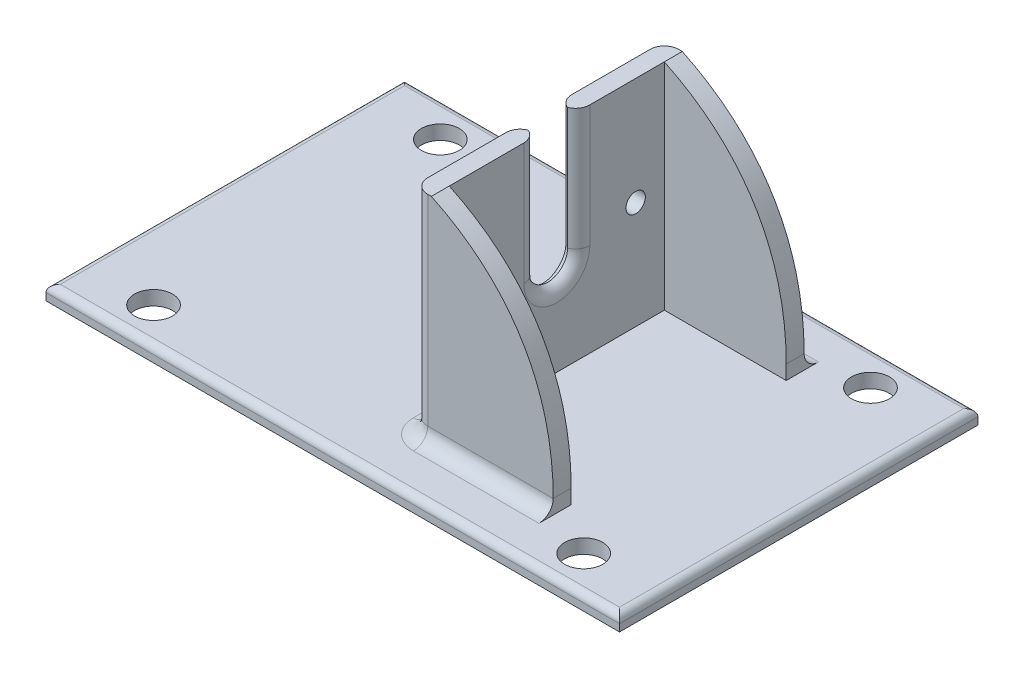
ISO-10303-21;
HEADER;
FILE_DESCRIPTION(('STEP AP214'),'2;1');
FILE_NAME('part.step','',(''),(''),'','','');
FILE_SCHEMA(('AUTOMOTIVE_DESIGN { 1 0 10303 214 1 1 1 1 }'));
ENDSEC;
DATA;
#1=APPLICATION_CONTEXT('core data for automotive mechanical design processes');
#2=APPLICATION_PROTOCOL_DEFINITION('international standard','automotive_design',2000,#1);
#3=PRODUCT_CONTEXT('',#1,'mechanical');
#4=PRODUCT('Part','Part','',(#3));
#5=PRODUCT_RELATED_PRODUCT_CATEGORY('part','',(#4));
#6=PRODUCT_DEFINITION_FORMATION('','',#4);
#7=PRODUCT_DEFINITION_CONTEXT('part definition',#1,'design');
#8=PRODUCT_DEFINITION('design','',#6,#7);
#9=PRODUCT_DEFINITION_SHAPE('','',#8);
#10=(LENGTH_UNIT() NAMED_UNIT(*) SI_UNIT(.MILLI.,.METRE.));
#11=(NAMED_UNIT(*) PLANE_ANGLE_UNIT() SI_UNIT($,.RADIAN.));
#12=(NAMED_UNIT(*) SI_UNIT($,.STERADIAN.) SOLID_ANGLE_UNIT());
#13=UNCERTAINTY_MEASURE_WITH_UNIT(LENGTH_MEASURE(1.E-05),#10,'distance_accuracy_value','');
#14=(GEOMETRIC_REPRESENTATION_CONTEXT(3) GLOBAL_UNCERTAINTY_ASSIGNED_CONTEXT((#13)) GLOBAL_UNIT_ASSIGNED_CONTEXT((#10,
#11,#12)) REPRESENTATION_CONTEXT('',''));
#15=CARTESIAN_POINT('',(0.,0.,0.));
#16=DIRECTION('',(0.,0.,1.));
#17=DIRECTION('',(1.,0.,0.));
#18=AXIS2_PLACEMENT_3D('',#15,#16,#17);
#19=CARTESIAN_POINT('',(23.25,32.,0.));
#20=DIRECTION('',(1.,0.,0.));
#21=DIRECTION('',(0.,0.,-1.));
#22=AXIS2_PLACEMENT_3D('',#19,#20,#21);
#23=PLANE('',#22);
#24=CARTESIAN_POINT('',(23.25,4.,-19.5));
#25=DIRECTION('',(1.,0.,0.));
#26=DIRECTION('',(0.,0.,-1.));
#27=AXIS2_PLACEMENT_3D('',#24,#25,#26);
#28=CIRCLE('',#27,2.);
#29=CARTESIAN_POINT('',(23.25,2.,-19.5));
#30=VERTEX_POINT('',#29);
#31=CARTESIAN_POINT('',(23.25,4.,-17.5));
#32=VERTEX_POINT('',#31);
#33=EDGE_CURVE('E370',#30,#32,#28,.F.);
#34=ORIENTED_EDGE('',*,*,#33,.T.);
#35=DIRECTION('',(0.,0.,1.));
#36=VECTOR('',#35,1.);
#37=CARTESIAN_POINT('',(23.25,4.,-25.));
#38=LINE('',#37,#36);
#39=CARTESIAN_POINT('',(23.25,4.,-15.));
#40=VERTEX_POINT('',#39);
#41=EDGE_CURVE('E482',#32,#40,#38,.T.);
#42=ORIENTED_EDGE('',*,*,#41,.T.);
#43=DIRECTION('',(0.,-1.,0.));
#44=VECTOR('',#43,1.);
#45=CARTESIAN_POINT('',(23.25,32.,-15.));
#46=LINE('',#45,#44);
#47=CARTESIAN_POINT('',(23.25,2.,-15.));
#48=VERTEX_POINT('',#47);
#49=EDGE_CURVE('E264',#40,#48,#46,.T.);
#50=ORIENTED_EDGE('',*,*,#49,.T.);
#51=DIRECTION('',(0.,0.,1.));
#52=VECTOR('',#51,1.);
#53=CARTESIAN_POINT('',(23.25,2.,0.));
#54=LINE('',#53,#52);
#55=EDGE_CURVE('E234',#30,#48,#54,.T.);
#56=ORIENTED_EDGE('',*,*,#55,.F.);
#57=EDGE_LOOP('',(#34,#42,#50,#56));
#58=FACE_BOUND('',#57,.T.);
#59=ADVANCED_FACE('F41',(#58),#23,.T.);
#60=CARTESIAN_POINT('',(6.25,32.,0.));
#61=DIRECTION('',(-1.,0.,0.));
#62=DIRECTION('',(0.,0.,1.));
#63=AXIS2_PLACEMENT_3D('',#60,#61,#62);
#64=PLANE('',#63);
#65=CARTESIAN_POINT('',(6.25,17.,-11.));
#66=DIRECTION('',(-1.,0.,0.));
#67=DIRECTION('',(0.,0.,1.));
#68=AXIS2_PLACEMENT_3D('',#65,#66,#67);
#69=CIRCLE('',#68,1.35);
#70=CARTESIAN_POINT('',(6.25,17.,-9.65));
#71=VERTEX_POINT('',#70);
#72=EDGE_CURVE('E243',#71,#71,#69,.F.);
#73=ORIENTED_EDGE('',*,*,#72,.F.);
#74=EDGE_LOOP('',(#73));
#75=FACE_BOUND('',#74,.T.);
#76=CARTESIAN_POINT('',(6.25,15.,0.));
#77=DIRECTION('',(-1.,0.,0.));
#78=DIRECTION('',(0.,0.,1.));
#79=AXIS2_PLACEMENT_3D('',#76,#77,#78);
#80=CIRCLE('',#79,4.6);
#81=CARTESIAN_POINT('',(6.25,15.,-4.6));
#82=VERTEX_POINT('',#81);
#83=CARTESIAN_POINT('',(6.25,15.,4.6));
#84=VERTEX_POINT('',#83);
#85=EDGE_CURVE('E333',#82,#84,#80,.T.);
#86=ORIENTED_EDGE('',*,*,#85,.T.);
#87=DIRECTION('',(0.,-1.,0.));
#88=VECTOR('',#87,1.);
#89=CARTESIAN_POINT('',(6.25,32.,4.6));
#90=LINE('',#89,#88);
#91=CARTESIAN_POINT('',(6.25,32.,4.6));
#92=VERTEX_POINT('',#91);
#93=EDGE_CURVE('E337',#84,#92,#90,.F.);
#94=ORIENTED_EDGE('',*,*,#93,.T.);
#95=DIRECTION('',(0.,0.,-1.));
#96=VECTOR('',#95,1.);
#97=CARTESIAN_POINT('',(6.25,32.,0.));
#98=LINE('',#97,#96);
#99=CARTESIAN_POINT('',(6.25,32.,15.));
#100=VERTEX_POINT('',#99);
#101=EDGE_CURVE('E237',#100,#92,#98,.T.);
#102=ORIENTED_EDGE('',*,*,#101,.F.);
#103=DIRECTION('',(0.,-1.,0.));
#104=VECTOR('',#103,1.);
#105=CARTESIAN_POINT('',(6.25,32.,15.));
#106=LINE('',#105,#104);
#107=CARTESIAN_POINT('',(6.25,2.,15.));
#108=VERTEX_POINT('',#107);
#109=EDGE_CURVE('E269',#100,#108,#106,.T.);
#110=ORIENTED_EDGE('',*,*,#109,.T.);
#111=DIRECTION('',(0.,0.,-1.));
#112=VECTOR('',#111,1.);
#113=CARTESIAN_POINT('',(6.25,2.,0.));
#114=LINE('',#113,#112);
#115=CARTESIAN_POINT('',(6.25,2.,-15.));
#116=VERTEX_POINT('',#115);
#117=EDGE_CURVE('E260',#108,#116,#114,.T.);
#118=ORIENTED_EDGE('',*,*,#117,.T.);
#119=DIRECTION('',(0.,-1.,0.));
#120=VECTOR('',#119,1.);
#121=CARTESIAN_POINT('',(6.25,32.,-15.));
#122=LINE('',#121,#120);
#123=CARTESIAN_POINT('',(6.25,32.,-15.));
#124=VERTEX_POINT('',#123);
#125=EDGE_CURVE('E266',#124,#116,#122,.T.);
#126=ORIENTED_EDGE('',*,*,#125,.F.);
#127=CARTESIAN_POINT('',(6.25,32.,-4.6));
#128=VERTEX_POINT('',#127);
#129=EDGE_CURVE('E233',#128,#124,#98,.T.);
#130=ORIENTED_EDGE('',*,*,#129,.F.);
#131=DIRECTION('',(0.,-1.,0.));
#132=VECTOR('',#131,1.);
#133=CARTESIAN_POINT('',(6.25,15.,-4.6));
#134=LINE('',#133,#132);
#135=EDGE_CURVE('E335',#128,#82,#134,.T.);
#136=ORIENTED_EDGE('',*,*,#135,.T.);
#137=EDGE_LOOP('',(#86,#94,#102,#110,#118,#126,#130,#136));
#138=FACE_BOUND('',#137,.T.);
#139=CARTESIAN_POINT('',(6.25,17.,11.));
#140=DIRECTION('',(-1.,0.,0.));
#141=DIRECTION('',(0.,0.,1.));
#142=AXIS2_PLACEMENT_3D('',#139,#140,#141);
#143=CIRCLE('',#142,1.35);
#144=CARTESIAN_POINT('',(6.25,17.,12.35));
#145=VERTEX_POINT('',#144);
#146=EDGE_CURVE('E1009',#145,#145,#143,.T.);
#147=ORIENTED_EDGE('',*,*,#146,.T.);
#148=EDGE_LOOP('',(#147));
#149=FACE_BOUND('',#148,.T.);
#150=ADVANCED_FACE('F491',(#75,#138,#149),#64,.F.);
#151=CARTESIAN_POINT('',(3.75,32.,0.));
#152=DIRECTION('',(-1.,0.,0.));
#153=DIRECTION('',(0.,0.,1.));
#154=AXIS2_PLACEMENT_3D('',#151,#152,#153);
#155=PLANE('',#154);
#156=CARTESIAN_POINT('',(3.75,15.,0.));
#157=DIRECTION('',(-1.,0.,0.));
#158=DIRECTION('',(0.,0.,1.));
#159=AXIS2_PLACEMENT_3D('',#156,#157,#158);
#160=CIRCLE('',#159,4.6);
#161=CARTESIAN_POINT('',(3.75,15.,4.6));
#162=VERTEX_POINT('',#161);
#163=CARTESIAN_POINT('',(3.75,15.,-4.6));
#164=VERTEX_POINT('',#163);
#165=EDGE_CURVE('E357',#162,#164,#160,.F.);
#166=ORIENTED_EDGE('',*,*,#165,.T.);
#167=DIRECTION('',(0.,1.,0.));
#168=VECTOR('',#167,1.);
#169=CARTESIAN_POINT('',(3.75,32.,-4.6));
#170=LINE('',#169,#168);
#171=CARTESIAN_POINT('',(3.75,32.,-4.6));
#172=VERTEX_POINT('',#171);
#173=EDGE_CURVE('E361',#164,#172,#170,.T.);
#174=ORIENTED_EDGE('',*,*,#173,.T.);
#175=DIRECTION('',(0.,0.,-1.));
#176=VECTOR('',#175,1.);
#177=CARTESIAN_POINT('',(3.75,32.,0.));
#178=LINE('',#177,#176);
#179=CARTESIAN_POINT('',(3.75,32.,-15.5));
#180=VERTEX_POINT('',#179);
#181=EDGE_CURVE('E249',#172,#180,#178,.T.);
#182=ORIENTED_EDGE('',*,*,#181,.T.);
#183=DIRECTION('',(0.,-1.,0.));
#184=VECTOR('',#183,1.);
#185=CARTESIAN_POINT('',(3.75,32.,-15.5));
#186=LINE('',#185,#184);
#187=CARTESIAN_POINT('',(3.75,4.,-15.5));
#188=VERTEX_POINT('',#187);
#189=EDGE_CURVE('E355',#180,#188,#186,.T.);
#190=ORIENTED_EDGE('',*,*,#189,.T.);
#191=DIRECTION('',(0.,0.,-1.));
#192=VECTOR('',#191,1.);
#193=CARTESIAN_POINT('',(3.75,4.,0.));
#194=LINE('',#193,#192);
#195=CARTESIAN_POINT('',(3.75,4.,15.5));
#196=VERTEX_POINT('',#195);
#197=EDGE_CURVE('E353',#188,#196,#194,.F.);
#198=ORIENTED_EDGE('',*,*,#197,.T.);
#199=DIRECTION('',(0.,-1.,0.));
#200=VECTOR('',#199,1.);
#201=CARTESIAN_POINT('',(3.75,32.,15.5));
#202=LINE('',#201,#200);
#203=CARTESIAN_POINT('',(3.75,32.,15.5));
#204=VERTEX_POINT('',#203);
#205=EDGE_CURVE('E351',#196,#204,#202,.F.);
#206=ORIENTED_EDGE('',*,*,#205,.T.);
#207=CARTESIAN_POINT('',(3.75,32.,4.6));
#208=VERTEX_POINT('',#207);
#209=EDGE_CURVE('E252',#204,#208,#178,.T.);
#210=ORIENTED_EDGE('',*,*,#209,.T.);
#211=DIRECTION('',(0.,1.,0.));
#212=VECTOR('',#211,1.);
#213=CARTESIAN_POINT('',(3.75,15.,4.6));
#214=LINE('',#213,#212);
#215=EDGE_CURVE('E359',#208,#162,#214,.F.);
#216=ORIENTED_EDGE('',*,*,#215,.T.);
#217=EDGE_LOOP('',(#166,#174,#182,#190,#198,#206,#210,#216));
#218=FACE_BOUND('',#217,.T.);
#219=CARTESIAN_POINT('',(3.75,17.,-11.));
#220=DIRECTION('',(-1.,0.,0.));
#221=DIRECTION('',(0.,0.,1.));
#222=AXIS2_PLACEMENT_3D('',#219,#220,#221);
#223=CIRCLE('',#222,1.35);
#224=CARTESIAN_POINT('',(3.75,17.,-9.65));
#225=VERTEX_POINT('',#224);
#226=EDGE_CURVE('E393',#225,#225,#223,.T.);
#227=ORIENTED_EDGE('',*,*,#226,.F.);
#228=EDGE_LOOP('',(#227));
#229=FACE_BOUND('',#228,.T.);
#230=CARTESIAN_POINT('',(3.75,17.,11.));
#231=DIRECTION('',(-1.,0.,0.));
#232=DIRECTION('',(0.,0.,1.));
#233=AXIS2_PLACEMENT_3D('',#230,#231,#232);
#234=CIRCLE('',#233,1.35);
#235=CARTESIAN_POINT('',(3.75,17.,12.35));
#236=VERTEX_POINT('',#235);
#237=EDGE_CURVE('E257',#236,#236,#234,.F.);
#238=ORIENTED_EDGE('',*,*,#237,.T.);
#239=EDGE_LOOP('',(#238));
#240=FACE_BOUND('',#239,.T.);
#241=ADVANCED_FACE('F530',(#218,#229,#240),#155,.T.);
#242=CARTESIAN_POINT('',(0.,32.,0.));
#243=DIRECTION('',(0.,1.,0.));
#244=DIRECTION('',(0.,0.,1.));
#245=AXIS2_PLACEMENT_3D('',#242,#243,#244);
#246=PLANE('',#245);
#247=DIRECTION('',(0.,0.,1.));
#248=VECTOR('',#247,1.);
#249=CARTESIAN_POINT('',(6.25,32.,-25.));
#250=LINE('',#249,#248);
#251=CARTESIAN_POINT('',(6.25,32.,-17.5));
#252=VERTEX_POINT('',#251);
#253=EDGE_CURVE('E218',#252,#124,#250,.T.);
#254=ORIENTED_EDGE('',*,*,#253,.F.);
#255=DIRECTION('',(1.,0.,0.));
#256=VECTOR('',#255,1.);
#257=CARTESIAN_POINT('',(0.,32.,-17.5));
#258=LINE('',#257,#256);
#259=CARTESIAN_POINT('',(5.75,32.,-17.5));
#260=VERTEX_POINT('',#259);
#261=EDGE_CURVE('E246',#260,#252,#258,.T.);
#262=ORIENTED_EDGE('',*,*,#261,.F.);
#263=CARTESIAN_POINT('',(5.75,32.,-15.5));
#264=DIRECTION('',(0.,1.,0.));
#265=DIRECTION('',(0.,0.,1.));
#266=AXIS2_PLACEMENT_3D('',#263,#264,#265);
#267=CIRCLE('',#266,2.);
#268=EDGE_CURVE('E345',#260,#180,#267,.T.);
#269=ORIENTED_EDGE('',*,*,#268,.T.);
#270=ORIENTED_EDGE('',*,*,#181,.F.);
#271=CARTESIAN_POINT('',(5.75,32.,-4.6));
#272=DIRECTION('',(0.,1.,0.));
#273=DIRECTION('',(0.,0.,1.));
#274=AXIS2_PLACEMENT_3D('',#271,#272,#273);
#275=CIRCLE('',#274,2.);
#276=CARTESIAN_POINT('',(5.,32.,-2.74595037822608));
#277=VERTEX_POINT('',#276);
#278=EDGE_CURVE('E347',#172,#277,#275,.T.);
#279=ORIENTED_EDGE('',*,*,#278,.T.);
#280=CARTESIAN_POINT('',(4.25,32.,-4.6));
#281=DIRECTION('',(0.,1.,0.));
#282=DIRECTION('',(0.,0.,1.));
#283=AXIS2_PLACEMENT_3D('',#280,#281,#282);
#284=CIRCLE('',#283,2.);
#285=EDGE_CURVE('E349',#277,#128,#284,.T.);
#286=ORIENTED_EDGE('',*,*,#285,.T.);
#287=ORIENTED_EDGE('',*,*,#129,.T.);
#288=EDGE_LOOP('',(#254,#262,#269,#270,#279,#286,#287));
#289=FACE_BOUND('',#288,.T.);
#290=ADVANCED_FACE('F463',(#289),#246,.T.);
#291=CARTESIAN_POINT('',(0.,2.,0.));
#292=DIRECTION('',(0.,-1.,0.));
#293=DIRECTION('',(0.,0.,-1.));
#294=AXIS2_PLACEMENT_3D('',#291,#292,#293);
#295=PLANE('',#294);
#296=DIRECTION('',(1.,0.,0.));
#297=VECTOR('',#296,1.);
#298=CARTESIAN_POINT('',(0.,2.,24.));
#299=LINE('',#298,#297);
#300=CARTESIAN_POINT('',(-39.,2.,24.));
#301=VERTEX_POINT('',#300);
#302=CARTESIAN_POINT('',(39.,2.,24.));
#303=VERTEX_POINT('',#302);
#304=EDGE_CURVE('E373',#301,#303,#299,.T.);
#305=ORIENTED_EDGE('',*,*,#304,.T.);
#306=DIRECTION('',(0.,0.,-1.));
#307=VECTOR('',#306,1.);
#308=CARTESIAN_POINT('',(39.,2.,0.));
#309=LINE('',#308,#307);
#310=CARTESIAN_POINT('',(39.,2.,-24.));
#311=VERTEX_POINT('',#310);
#312=EDGE_CURVE('E419',#303,#311,#309,.T.);
#313=ORIENTED_EDGE('',*,*,#312,.T.);
#314=DIRECTION('',(-1.,0.,0.));
#315=VECTOR('',#314,1.);
#316=CARTESIAN_POINT('',(0.,2.,-24.));
#317=LINE('',#316,#315);
#318=CARTESIAN_POINT('',(-39.,2.,-24.));
#319=VERTEX_POINT('',#318);
#320=EDGE_CURVE('E417',#311,#319,#317,.T.);
#321=ORIENTED_EDGE('',*,*,#320,.T.);
#322=DIRECTION('',(0.,0.,1.));
#323=VECTOR('',#322,1.);
#324=CARTESIAN_POINT('',(-39.,2.,0.));
#325=LINE('',#324,#323);
#326=EDGE_CURVE('E415',#319,#301,#325,.T.);
#327=ORIENTED_EDGE('',*,*,#326,.T.);
#328=EDGE_LOOP('',(#305,#313,#321,#327));
#329=FACE_BOUND('',#328,.T.);
#330=CARTESIAN_POINT('',(30.,2.,20.));
#331=DIRECTION('',(0.,1.,0.));
#332=DIRECTION('',(0.,0.,1.));
#333=AXIS2_PLACEMENT_3D('',#330,#331,#332);
#334=CIRCLE('',#333,2.65);
#335=CARTESIAN_POINT('',(30.,2.,22.65));
#336=VERTEX_POINT('',#335);
#337=EDGE_CURVE('E274',#336,#336,#334,.T.);
#338=ORIENTED_EDGE('',*,*,#337,.F.);
#339=EDGE_LOOP('',(#338));
#340=FACE_BOUND('',#339,.T.);
#341=CARTESIAN_POINT('',(-30.,2.,20.));
#342=DIRECTION('',(0.,1.,0.));
#343=DIRECTION('',(0.,0.,-1.));
#344=AXIS2_PLACEMENT_3D('',#341,#342,#343);
#345=CIRCLE('',#344,2.65);
#346=CARTESIAN_POINT('',(-30.,2.,17.35));
#347=VERTEX_POINT('',#346);
#348=EDGE_CURVE('E280',#347,#347,#345,.T.);
#349=ORIENTED_EDGE('',*,*,#348,.F.);
#350=EDGE_LOOP('',(#349));
#351=FACE_BOUND('',#350,.T.);
#352=CARTESIAN_POINT('',(30.,2.,-20.));
#353=DIRECTION('',(0.,1.,0.));
#354=DIRECTION('',(0.,0.,-1.));
#355=AXIS2_PLACEMENT_3D('',#352,#353,#354);
#356=CIRCLE('',#355,2.65);
#357=CARTESIAN_POINT('',(30.,2.,-22.65));
#358=VERTEX_POINT('',#357);
#359=EDGE_CURVE('E286',#358,#358,#356,.T.);
#360=ORIENTED_EDGE('',*,*,#359,.F.);
#361=EDGE_LOOP('',(#360));
#362=FACE_BOUND('',#361,.T.);
#363=CARTESIAN_POINT('',(-30.,2.,-20.));
#364=DIRECTION('',(0.,1.,0.));
#365=DIRECTION('',(0.,0.,1.));
#366=AXIS2_PLACEMENT_3D('',#363,#364,#365);
#367=CIRCLE('',#366,2.65);
#368=CARTESIAN_POINT('',(-30.,2.,-17.35));
#369=VERTEX_POINT('',#368);
#370=EDGE_CURVE('E292',#369,#369,#367,.T.);
#371=ORIENTED_EDGE('',*,*,#370,.F.);
#372=EDGE_LOOP('',(#371));
#373=FACE_BOUND('',#372,.T.);
#374=DIRECTION('',(1.,0.,0.));
#375=VECTOR('',#374,1.);
#376=CARTESIAN_POINT('',(0.,2.,-19.5));
#377=LINE('',#376,#375);
#378=CARTESIAN_POINT('',(5.75,2.,-19.5));
#379=VERTEX_POINT('',#378);
#380=EDGE_CURVE('E325',#379,#30,#377,.T.);
#381=ORIENTED_EDGE('',*,*,#380,.T.);
#382=ORIENTED_EDGE('',*,*,#55,.T.);
#383=DIRECTION('',(1.,0.,0.));
#384=VECTOR('',#383,1.);
#385=CARTESIAN_POINT('',(0.,2.,-15.));
#386=LINE('',#385,#384);
#387=EDGE_CURVE('E240',#116,#48,#386,.T.);
#388=ORIENTED_EDGE('',*,*,#387,.F.);
#389=ORIENTED_EDGE('',*,*,#117,.F.);
#390=DIRECTION('',(1.,0.,0.));
#391=VECTOR('',#390,1.);
#392=CARTESIAN_POINT('',(0.,2.,15.));
#393=LINE('',#392,#391);
#394=CARTESIAN_POINT('',(23.25,2.,15.));
#395=VERTEX_POINT('',#394);
#396=EDGE_CURVE('E256',#108,#395,#393,.T.);
#397=ORIENTED_EDGE('',*,*,#396,.T.);
#398=DIRECTION('',(0.,0.,-1.));
#399=VECTOR('',#398,1.);
#400=CARTESIAN_POINT('',(23.25,2.,0.));
#401=LINE('',#400,#399);
#402=CARTESIAN_POINT('',(23.25,2.,19.5));
#403=VERTEX_POINT('',#402);
#404=EDGE_CURVE('E253',#403,#395,#401,.T.);
#405=ORIENTED_EDGE('',*,*,#404,.F.);
#406=DIRECTION('',(1.,0.,0.));
#407=VECTOR('',#406,1.);
#408=CARTESIAN_POINT('',(3.75,2.,19.5));
#409=LINE('',#408,#407);
#410=CARTESIAN_POINT('',(5.75,2.,19.5));
#411=VERTEX_POINT('',#410);
#412=EDGE_CURVE('E331',#403,#411,#409,.F.);
#413=ORIENTED_EDGE('',*,*,#412,.T.);
#414=CARTESIAN_POINT('',(5.75,2.,15.5));
#415=DIRECTION('',(0.,-1.,0.));
#416=DIRECTION('',(0.,0.,-1.));
#417=AXIS2_PLACEMENT_3D('',#414,#415,#416);
#418=CIRCLE('',#417,4.);
#419=CARTESIAN_POINT('',(1.75,2.,15.5));
#420=VERTEX_POINT('',#419);
#421=EDGE_CURVE('E328',#420,#411,#418,.F.);
#422=ORIENTED_EDGE('',*,*,#421,.F.);
#423=DIRECTION('',(0.,0.,-1.));
#424=VECTOR('',#423,1.);
#425=CARTESIAN_POINT('',(1.75,2.,0.));
#426=LINE('',#425,#424);
#427=CARTESIAN_POINT('',(1.75,2.,-15.5));
#428=VERTEX_POINT('',#427);
#429=EDGE_CURVE('E323',#420,#428,#426,.T.);
#430=ORIENTED_EDGE('',*,*,#429,.T.);
#431=CARTESIAN_POINT('',(5.75,2.,-15.5));
#432=DIRECTION('',(0.,-1.,0.));
#433=DIRECTION('',(0.,0.,-1.));
#434=AXIS2_PLACEMENT_3D('',#431,#432,#433);
#435=CIRCLE('',#434,4.);
#436=EDGE_CURVE('E320',#379,#428,#435,.F.);
#437=ORIENTED_EDGE('',*,*,#436,.F.);
#438=EDGE_LOOP('',(#381,#382,#388,#389,#397,#405,#413,#422,#430,#437));
#439=FACE_BOUND('',#438,.T.);
#440=ADVANCED_FACE('F459',(#329,#340,#351,#362,#373,#439),#295,.F.);
#441=CARTESIAN_POINT('',(0.,0.,0.));
#442=DIRECTION('',(0.,-1.,0.));
#443=DIRECTION('',(0.,0.,-1.));
#444=AXIS2_PLACEMENT_3D('',#441,#442,#443);
#445=PLANE('',#444);
#446=CARTESIAN_POINT('',(-30.,0.,20.));
#447=DIRECTION('',(0.,1.,0.));
#448=DIRECTION('',(0.,0.,-1.));
#449=AXIS2_PLACEMENT_3D('',#446,#447,#448);
#450=CIRCLE('',#449,2.65);
#451=CARTESIAN_POINT('',(-30.,0.,17.35));
#452=VERTEX_POINT('',#451);
#453=EDGE_CURVE('E277',#452,#452,#450,.T.);
#454=ORIENTED_EDGE('',*,*,#453,.T.);
#455=EDGE_LOOP('',(#454));
#456=FACE_BOUND('',#455,.T.);
#457=CARTESIAN_POINT('',(-30.,0.,-20.));
#458=DIRECTION('',(0.,1.,0.));
#459=DIRECTION('',(0.,0.,1.));
#460=AXIS2_PLACEMENT_3D('',#457,#458,#459);
#461=CIRCLE('',#460,2.65);
#462=CARTESIAN_POINT('',(-30.,0.,-17.35));
#463=VERTEX_POINT('',#462);
#464=EDGE_CURVE('E289',#463,#463,#461,.T.);
#465=ORIENTED_EDGE('',*,*,#464,.T.);
#466=EDGE_LOOP('',(#465));
#467=FACE_BOUND('',#466,.T.);
#468=DIRECTION('',(0.,0.,-1.));
#469=VECTOR('',#468,1.);
#470=CARTESIAN_POINT('',(40.,0.,25.));
#471=LINE('',#470,#469);
#472=CARTESIAN_POINT('',(40.,0.,25.));
#473=VERTEX_POINT('',#472);
#474=CARTESIAN_POINT('',(40.,0.,-25.));
#475=VERTEX_POINT('',#474);
#476=EDGE_CURVE('E295',#473,#475,#471,.T.);
#477=ORIENTED_EDGE('',*,*,#476,.F.);
#478=DIRECTION('',(1.,0.,0.));
#479=VECTOR('',#478,1.);
#480=CARTESIAN_POINT('',(-40.,0.,25.));
#481=LINE('',#480,#479);
#482=CARTESIAN_POINT('',(-40.,0.,25.));
#483=VERTEX_POINT('',#482);
#484=EDGE_CURVE('E306',#483,#473,#481,.T.);
#485=ORIENTED_EDGE('',*,*,#484,.F.);
#486=DIRECTION('',(0.,0.,1.));
#487=VECTOR('',#486,1.);
#488=CARTESIAN_POINT('',(-40.,0.,25.));
#489=LINE('',#488,#487);
#490=CARTESIAN_POINT('',(-40.,0.,-25.));
#491=VERTEX_POINT('',#490);
#492=EDGE_CURVE('E303',#491,#483,#489,.T.);
#493=ORIENTED_EDGE('',*,*,#492,.F.);
#494=DIRECTION('',(-1.,0.,0.));
#495=VECTOR('',#494,1.);
#496=CARTESIAN_POINT('',(-40.,0.,-25.));
#497=LINE('',#496,#495);
#498=EDGE_CURVE('E300',#475,#491,#497,.T.);
#499=ORIENTED_EDGE('',*,*,#498,.F.);
#500=EDGE_LOOP('',(#477,#485,#493,#499));
#501=FACE_BOUND('',#500,.T.);
#502=CARTESIAN_POINT('',(30.,0.,-20.));
#503=DIRECTION('',(0.,1.,0.));
#504=DIRECTION('',(0.,0.,-1.));
#505=AXIS2_PLACEMENT_3D('',#502,#503,#504);
#506=CIRCLE('',#505,2.65);
#507=CARTESIAN_POINT('',(30.,0.,-22.65));
#508=VERTEX_POINT('',#507);
#509=EDGE_CURVE('E283',#508,#508,#506,.T.);
#510=ORIENTED_EDGE('',*,*,#509,.T.);
#511=EDGE_LOOP('',(#510));
#512=FACE_BOUND('',#511,.T.);
#513=CARTESIAN_POINT('',(30.,0.,20.));
#514=DIRECTION('',(0.,1.,0.));
#515=DIRECTION('',(0.,0.,1.));
#516=AXIS2_PLACEMENT_3D('',#513,#514,#515);
#517=CIRCLE('',#516,2.65);
#518=CARTESIAN_POINT('',(30.,0.,22.65));
#519=VERTEX_POINT('',#518);
#520=EDGE_CURVE('E273',#519,#519,#517,.T.);
#521=ORIENTED_EDGE('',*,*,#520,.T.);
#522=EDGE_LOOP('',(#521));
#523=FACE_BOUND('',#522,.T.);
#524=ADVANCED_FACE('F462',(#456,#467,#501,#512,#523),#445,.T.);
#525=CARTESIAN_POINT('',(40.,2.,25.));
#526=DIRECTION('',(-1.,0.,0.));
#527=DIRECTION('',(0.,0.,1.));
#528=AXIS2_PLACEMENT_3D('',#525,#526,#527);
#529=PLANE('',#528);
#530=DIRECTION('',(0.,-1.,0.));
#531=VECTOR('',#530,1.);
#532=CARTESIAN_POINT('',(40.,2.,-25.));
#533=LINE('',#532,#531);
#534=CARTESIAN_POINT('',(40.,1.,-25.));
#535=VERTEX_POINT('',#534);
#536=EDGE_CURVE('E315',#535,#475,#533,.T.);
#537=ORIENTED_EDGE('',*,*,#536,.F.);
#538=DIRECTION('',(0.,0.,-1.));
#539=VECTOR('',#538,1.);
#540=CARTESIAN_POINT('',(40.,1.,25.));
#541=LINE('',#540,#539);
#542=CARTESIAN_POINT('',(40.,1.,25.));
#543=VERTEX_POINT('',#542);
#544=EDGE_CURVE('E422',#535,#543,#541,.F.);
#545=ORIENTED_EDGE('',*,*,#544,.T.);
#546=DIRECTION('',(0.,-1.,0.));
#547=VECTOR('',#546,1.);
#548=CARTESIAN_POINT('',(40.,2.,25.));
#549=LINE('',#548,#547);
#550=EDGE_CURVE('E309',#543,#473,#549,.T.);
#551=ORIENTED_EDGE('',*,*,#550,.T.);
#552=ORIENTED_EDGE('',*,*,#476,.T.);
#553=EDGE_LOOP('',(#537,#545,#551,#552));
#554=FACE_BOUND('',#553,.T.);
#555=ADVANCED_FACE('F453',(#554),#529,.F.);
#556=CARTESIAN_POINT('',(-40.,2.,-25.));
#557=DIRECTION('',(0.,0.,1.));
#558=DIRECTION('',(1.,0.,0.));
#559=AXIS2_PLACEMENT_3D('',#556,#557,#558);
#560=PLANE('',#559);
#561=DIRECTION('',(0.,-1.,0.));
#562=VECTOR('',#561,1.);
#563=CARTESIAN_POINT('',(-40.,2.,-25.));
#564=LINE('',#563,#562);
#565=CARTESIAN_POINT('',(-40.,1.,-25.));
#566=VERTEX_POINT('',#565);
#567=EDGE_CURVE('E313',#566,#491,#564,.T.);
#568=ORIENTED_EDGE('',*,*,#567,.F.);
#569=DIRECTION('',(-1.,0.,0.));
#570=VECTOR('',#569,1.);
#571=CARTESIAN_POINT('',(-40.,1.,-25.));
#572=LINE('',#571,#570);
#573=EDGE_CURVE('E425',#566,#535,#572,.F.);
#574=ORIENTED_EDGE('',*,*,#573,.T.);
#575=ORIENTED_EDGE('',*,*,#536,.T.);
#576=ORIENTED_EDGE('',*,*,#498,.T.);
#577=EDGE_LOOP('',(#568,#574,#575,#576));
#578=FACE_BOUND('',#577,.T.);
#579=ADVANCED_FACE('F449',(#578),#560,.F.);
#580=CARTESIAN_POINT('',(-40.,2.,25.));
#581=DIRECTION('',(1.,0.,0.));
#582=DIRECTION('',(0.,0.,-1.));
#583=AXIS2_PLACEMENT_3D('',#580,#581,#582);
#584=PLANE('',#583);
#585=DIRECTION('',(0.,-1.,0.));
#586=VECTOR('',#585,1.);
#587=CARTESIAN_POINT('',(-40.,2.,25.));
#588=LINE('',#587,#586);
#589=CARTESIAN_POINT('',(-40.,1.,25.));
#590=VERTEX_POINT('',#589);
#591=EDGE_CURVE('E311',#590,#483,#588,.T.);
#592=ORIENTED_EDGE('',*,*,#591,.F.);
#593=DIRECTION('',(0.,0.,1.));
#594=VECTOR('',#593,1.);
#595=CARTESIAN_POINT('',(-40.,1.,25.));
#596=LINE('',#595,#594);
#597=EDGE_CURVE('E50',#590,#566,#596,.F.);
#598=ORIENTED_EDGE('',*,*,#597,.T.);
#599=ORIENTED_EDGE('',*,*,#567,.T.);
#600=ORIENTED_EDGE('',*,*,#492,.T.);
#601=EDGE_LOOP('',(#592,#598,#599,#600));
#602=FACE_BOUND('',#601,.T.);
#603=ADVANCED_FACE('F567',(#602),#584,.F.);
#604=CARTESIAN_POINT('',(-40.,2.,25.));
#605=DIRECTION('',(0.,0.,-1.));
#606=DIRECTION('',(-1.,0.,0.));
#607=AXIS2_PLACEMENT_3D('',#604,#605,#606);
#608=PLANE('',#607);
#609=ORIENTED_EDGE('',*,*,#550,.F.);
#610=DIRECTION('',(1.,0.,0.));
#611=VECTOR('',#610,1.);
#612=CARTESIAN_POINT('',(-40.,1.,25.));
#613=LINE('',#612,#611);
#614=EDGE_CURVE('E11',#543,#590,#613,.F.);
#615=ORIENTED_EDGE('',*,*,#614,.T.);
#616=ORIENTED_EDGE('',*,*,#591,.T.);
#617=ORIENTED_EDGE('',*,*,#484,.T.);
#618=EDGE_LOOP('',(#609,#615,#616,#617));
#619=FACE_BOUND('',#618,.T.);
#620=ADVANCED_FACE('F559',(#619),#608,.F.);
#621=CARTESIAN_POINT('',(-30.,2.,-20.));
#622=DIRECTION('',(0.,-1.,0.));
#623=DIRECTION('',(0.,0.,-1.));
#624=AXIS2_PLACEMENT_3D('',#621,#622,#623);
#625=CYLINDRICAL_SURFACE('',#624,2.65);
#626=ORIENTED_EDGE('',*,*,#370,.T.);
#627=EDGE_LOOP('',(#626));
#628=FACE_BOUND('',#627,.T.);
#629=ORIENTED_EDGE('',*,*,#464,.F.);
#630=EDGE_LOOP('',(#629));
#631=FACE_BOUND('',#630,.T.);
#632=ADVANCED_FACE('F556',(#628,#631),#625,.F.);
#633=CARTESIAN_POINT('',(30.,2.,-20.));
#634=DIRECTION('',(0.,-1.,0.));
#635=DIRECTION('',(0.,0.,-1.));
#636=AXIS2_PLACEMENT_3D('',#633,#634,#635);
#637=CYLINDRICAL_SURFACE('',#636,2.65);
#638=ORIENTED_EDGE('',*,*,#359,.T.);
#639=EDGE_LOOP('',(#638));
#640=FACE_BOUND('',#639,.T.);
#641=ORIENTED_EDGE('',*,*,#509,.F.);
#642=EDGE_LOOP('',(#641));
#643=FACE_BOUND('',#642,.T.);
#644=ADVANCED_FACE('F552',(#640,#643),#637,.F.);
#645=CARTESIAN_POINT('',(-30.,2.,20.));
#646=DIRECTION('',(0.,-1.,0.));
#647=DIRECTION('',(0.,0.,-1.));
#648=AXIS2_PLACEMENT_3D('',#645,#646,#647);
#649=CYLINDRICAL_SURFACE('',#648,2.65);
#650=ORIENTED_EDGE('',*,*,#348,.T.);
#651=EDGE_LOOP('',(#650));
#652=FACE_BOUND('',#651,.T.);
#653=ORIENTED_EDGE('',*,*,#453,.F.);
#654=EDGE_LOOP('',(#653));
#655=FACE_BOUND('',#654,.T.);
#656=ADVANCED_FACE('F548',(#652,#655),#649,.F.);
#657=CARTESIAN_POINT('',(30.,2.,20.));
#658=DIRECTION('',(0.,-1.,0.));
#659=DIRECTION('',(0.,0.,-1.));
#660=AXIS2_PLACEMENT_3D('',#657,#658,#659);
#661=CYLINDRICAL_SURFACE('',#660,2.65);
#662=ORIENTED_EDGE('',*,*,#337,.T.);
#663=EDGE_LOOP('',(#662));
#664=FACE_BOUND('',#663,.T.);
#665=ORIENTED_EDGE('',*,*,#520,.F.);
#666=EDGE_LOOP('',(#665));
#667=FACE_BOUND('',#666,.T.);
#668=ADVANCED_FACE('F545',(#664,#667),#661,.F.);
#669=CARTESIAN_POINT('',(0.,32.,17.5));
#670=DIRECTION('',(0.,0.,-1.));
#671=DIRECTION('',(-1.,0.,0.));
#672=AXIS2_PLACEMENT_3D('',#669,#670,#671);
#673=PLANE('',#672);
#674=DIRECTION('',(1.,0.,0.));
#675=VECTOR('',#674,1.);
#676=CARTESIAN_POINT('',(23.25,4.,17.5));
#677=LINE('',#676,#675);
#678=CARTESIAN_POINT('',(5.75,4.,17.5));
#679=VERTEX_POINT('',#678);
#680=CARTESIAN_POINT('',(23.25,4.,17.5));
#681=VERTEX_POINT('',#680);
#682=EDGE_CURVE('E227',#679,#681,#677,.T.);
#683=ORIENTED_EDGE('',*,*,#682,.T.);
#684=CARTESIAN_POINT('',(6.25,32.,17.5));
#685=CARTESIAN_POINT('',(16.5349644576756,27.0886693850157,17.5));
#686=CARTESIAN_POINT('',(23.25,17.8814344012522,17.5));
#687=CARTESIAN_POINT('',(23.25,3.99999999999999,17.5));
#688=B_SPLINE_CURVE_WITH_KNOTS('',3,(#684,#685,#686,#687),.UNSPECIFIED.,.F.,.F.,(4,4),(0.,1.),.UNSPECIFIED.);
#689=CARTESIAN_POINT('',(6.25,32.,17.5));
#690=VERTEX_POINT('',#689);
#691=EDGE_CURVE('E210',#690,#681,#688,.T.);
#692=ORIENTED_EDGE('',*,*,#691,.F.);
#693=DIRECTION('',(1.,0.,0.));
#694=VECTOR('',#693,1.);
#695=CARTESIAN_POINT('',(0.,32.,17.5));
#696=LINE('',#695,#694);
#697=CARTESIAN_POINT('',(5.75,32.,17.5));
#698=VERTEX_POINT('',#697);
#699=EDGE_CURVE('E224',#698,#690,#696,.T.);
#700=ORIENTED_EDGE('',*,*,#699,.F.);
#701=DIRECTION('',(0.,-1.,0.));
#702=VECTOR('',#701,1.);
#703=CARTESIAN_POINT('',(5.75,2.,17.5));
#704=LINE('',#703,#702);
#705=EDGE_CURVE('E317',#698,#679,#704,.T.);
#706=ORIENTED_EDGE('',*,*,#705,.T.);
#707=EDGE_LOOP('',(#683,#692,#700,#706));
#708=FACE_BOUND('',#707,.T.);
#709=ADVANCED_FACE('F223',(#708),#673,.F.);
#710=CARTESIAN_POINT('',(23.25,32.,0.));
#711=DIRECTION('',(-1.,0.,0.));
#712=DIRECTION('',(0.,0.,1.));
#713=AXIS2_PLACEMENT_3D('',#710,#711,#712);
#714=PLANE('',#713);
#715=DIRECTION('',(0.,-1.,0.));
#716=VECTOR('',#715,1.);
#717=CARTESIAN_POINT('',(23.25,32.,15.));
#718=LINE('',#717,#716);
#719=CARTESIAN_POINT('',(23.25,4.,15.));
#720=VERTEX_POINT('',#719);
#721=EDGE_CURVE('E271',#720,#395,#718,.T.);
#722=ORIENTED_EDGE('',*,*,#721,.F.);
#723=EDGE_CURVE('E988',#720,#681,#38,.T.);
#724=ORIENTED_EDGE('',*,*,#723,.T.);
#725=CARTESIAN_POINT('',(23.25,4.,19.5));
#726=DIRECTION('',(-1.,0.,0.));
#727=DIRECTION('',(0.,0.,1.));
#728=AXIS2_PLACEMENT_3D('',#725,#726,#727);
#729=CIRCLE('',#728,2.);
#730=EDGE_CURVE('E367',#681,#403,#729,.T.);
#731=ORIENTED_EDGE('',*,*,#730,.T.);
#732=ORIENTED_EDGE('',*,*,#404,.T.);
#733=EDGE_LOOP('',(#722,#724,#731,#732));
#734=FACE_BOUND('',#733,.T.);
#735=ADVANCED_FACE('F499',(#734),#714,.F.);
#736=CARTESIAN_POINT('',(0.,32.,15.));
#737=DIRECTION('',(0.,0.,-1.));
#738=DIRECTION('',(-1.,0.,0.));
#739=AXIS2_PLACEMENT_3D('',#736,#737,#738);
#740=PLANE('',#739);
#741=CARTESIAN_POINT('',(6.25,32.,15.));
#742=CARTESIAN_POINT('',(16.5349644576756,27.0886693850157,15.));
#743=CARTESIAN_POINT('',(23.25,17.8814344012522,15.));
#744=CARTESIAN_POINT('',(23.25,3.99999999999999,15.));
#745=B_SPLINE_CURVE_WITH_KNOTS('',3,(#741,#742,#743,#744),.UNSPECIFIED.,.F.,.F.,(4,4),(0.,1.),.UNSPECIFIED.);
#746=EDGE_CURVE('E213',#720,#100,#745,.F.);
#747=ORIENTED_EDGE('',*,*,#746,.F.);
#748=ORIENTED_EDGE('',*,*,#721,.T.);
#749=ORIENTED_EDGE('',*,*,#396,.F.);
#750=ORIENTED_EDGE('',*,*,#109,.F.);
#751=EDGE_LOOP('',(#747,#748,#749,#750));
#752=FACE_BOUND('',#751,.T.);
#753=ADVANCED_FACE('F496',(#752),#740,.T.);
#754=CARTESIAN_POINT('',(0.,32.,-15.));
#755=DIRECTION('',(0.,0.,-1.));
#756=DIRECTION('',(-1.,0.,0.));
#757=AXIS2_PLACEMENT_3D('',#754,#755,#756);
#758=PLANE('',#757);
#759=ORIENTED_EDGE('',*,*,#49,.F.);
#760=CARTESIAN_POINT('',(6.25,32.,-15.));
#761=CARTESIAN_POINT('',(16.5349644576756,27.0886693850157,-15.));
#762=CARTESIAN_POINT('',(23.25,17.8814344012522,-15.));
#763=CARTESIAN_POINT('',(23.25,3.99999999999999,-15.));
#764=B_SPLINE_CURVE_WITH_KNOTS('',3,(#760,#761,#762,#763),.UNSPECIFIED.,.F.,.F.,(4,4),(0.,1.),.UNSPECIFIED.);
#765=EDGE_CURVE('E985',#40,#124,#764,.F.);
#766=ORIENTED_EDGE('',*,*,#765,.T.);
#767=ORIENTED_EDGE('',*,*,#125,.T.);
#768=ORIENTED_EDGE('',*,*,#387,.T.);
#769=EDGE_LOOP('',(#759,#766,#767,#768));
#770=FACE_BOUND('',#769,.T.);
#771=ADVANCED_FACE('F486',(#770),#758,.F.);
#772=CARTESIAN_POINT('',(0.,32.,-17.5));
#773=DIRECTION('',(0.,0.,-1.));
#774=DIRECTION('',(-1.,0.,0.));
#775=AXIS2_PLACEMENT_3D('',#772,#773,#774);
#776=PLANE('',#775);
#777=CARTESIAN_POINT('',(6.25,32.,-17.5));
#778=CARTESIAN_POINT('',(16.5349644576756,27.0886693850157,-17.5));
#779=CARTESIAN_POINT('',(23.25,17.8814344012522,-17.5));
#780=CARTESIAN_POINT('',(23.25,3.99999999999999,-17.5));
#781=B_SPLINE_CURVE_WITH_KNOTS('',3,(#777,#778,#779,#780),.UNSPECIFIED.,.F.,.F.,(4,4),(0.,1.),.UNSPECIFIED.);
#782=EDGE_CURVE('E981',#32,#252,#781,.F.);
#783=ORIENTED_EDGE('',*,*,#782,.F.);
#784=DIRECTION('',(1.,0.,0.));
#785=VECTOR('',#784,1.);
#786=CARTESIAN_POINT('',(0.,4.,-17.5));
#787=LINE('',#786,#785);
#788=CARTESIAN_POINT('',(5.75,4.,-17.5));
#789=VERTEX_POINT('',#788);
#790=EDGE_CURVE('E363',#32,#789,#787,.F.);
#791=ORIENTED_EDGE('',*,*,#790,.T.);
#792=DIRECTION('',(0.,-1.,0.));
#793=VECTOR('',#792,1.);
#794=CARTESIAN_POINT('',(5.75,32.,-17.5));
#795=LINE('',#794,#793);
#796=EDGE_CURVE('E365',#789,#260,#795,.F.);
#797=ORIENTED_EDGE('',*,*,#796,.T.);
#798=ORIENTED_EDGE('',*,*,#261,.T.);
#799=EDGE_LOOP('',(#783,#791,#797,#798));
#800=FACE_BOUND('',#799,.T.);
#801=ADVANCED_FACE('F535',(#800),#776,.T.);
#802=EDGE_CURVE('E207',#100,#690,#250,.T.);
#803=ORIENTED_EDGE('',*,*,#802,.F.);
#804=ORIENTED_EDGE('',*,*,#101,.T.);
#805=CARTESIAN_POINT('',(4.25,32.,4.6));
#806=DIRECTION('',(0.,1.,0.));
#807=DIRECTION('',(0.,0.,1.));
#808=AXIS2_PLACEMENT_3D('',#805,#806,#807);
#809=CIRCLE('',#808,2.);
#810=CARTESIAN_POINT('',(5.,32.,2.74595037822608));
#811=VERTEX_POINT('',#810);
#812=EDGE_CURVE('E343',#92,#811,#809,.T.);
#813=ORIENTED_EDGE('',*,*,#812,.T.);
#814=CARTESIAN_POINT('',(5.75,32.,4.6));
#815=DIRECTION('',(0.,1.,0.));
#816=DIRECTION('',(0.,0.,1.));
#817=AXIS2_PLACEMENT_3D('',#814,#815,#816);
#818=CIRCLE('',#817,2.);
#819=EDGE_CURVE('E341',#811,#208,#818,.T.);
#820=ORIENTED_EDGE('',*,*,#819,.T.);
#821=ORIENTED_EDGE('',*,*,#209,.F.);
#822=CARTESIAN_POINT('',(5.75,32.,15.5));
#823=DIRECTION('',(0.,1.,0.));
#824=DIRECTION('',(0.,0.,1.));
#825=AXIS2_PLACEMENT_3D('',#822,#823,#824);
#826=CIRCLE('',#825,2.);
#827=EDGE_CURVE('E232',#204,#698,#826,.T.);
#828=ORIENTED_EDGE('',*,*,#827,.T.);
#829=ORIENTED_EDGE('',*,*,#699,.T.);
#830=EDGE_LOOP('',(#803,#804,#813,#820,#821,#828,#829));
#831=FACE_BOUND('',#830,.T.);
#832=ADVANCED_FACE('F229',(#831),#246,.T.);
#833=CARTESIAN_POINT('',(40.001,17.,-11.));
#834=DIRECTION('',(-1.,0.,0.));
#835=DIRECTION('',(0.,0.,1.));
#836=AXIS2_PLACEMENT_3D('',#833,#834,#835);
#837=CYLINDRICAL_SURFACE('',#836,1.35);
#838=ORIENTED_EDGE('',*,*,#226,.T.);
#839=EDGE_LOOP('',(#838));
#840=FACE_BOUND('',#839,.T.);
#841=ORIENTED_EDGE('',*,*,#72,.T.);
#842=EDGE_LOOP('',(#841));
#843=FACE_BOUND('',#842,.T.);
#844=ADVANCED_FACE('F771',(#840,#843),#837,.F.);
#845=CARTESIAN_POINT('',(40.001,17.,11.));
#846=DIRECTION('',(-1.,0.,0.));
#847=DIRECTION('',(0.,0.,1.));
#848=AXIS2_PLACEMENT_3D('',#845,#846,#847);
#849=CYLINDRICAL_SURFACE('',#848,1.35);
#850=ORIENTED_EDGE('',*,*,#237,.F.);
#851=EDGE_LOOP('',(#850));
#852=FACE_BOUND('',#851,.T.);
#853=ORIENTED_EDGE('',*,*,#146,.F.);
#854=EDGE_LOOP('',(#853));
#855=FACE_BOUND('',#854,.T.);
#856=ADVANCED_FACE('F762',(#852,#855),#849,.F.);
#857=CARTESIAN_POINT('',(0.,4.,-19.5));
#858=DIRECTION('',(1.,0.,0.));
#859=DIRECTION('',(0.,0.,-1.));
#860=AXIS2_PLACEMENT_3D('',#857,#858,#859);
#861=CYLINDRICAL_SURFACE('',#860,2.);
#862=ORIENTED_EDGE('',*,*,#33,.F.);
#863=ORIENTED_EDGE('',*,*,#380,.F.);
#864=CARTESIAN_POINT('',(5.75,4.,-19.5));
#865=DIRECTION('',(1.,0.,0.));
#866=DIRECTION('',(0.,0.,-1.));
#867=AXIS2_PLACEMENT_3D('',#864,#865,#866);
#868=CIRCLE('',#867,2.);
#869=EDGE_CURVE('E390',#789,#379,#868,.T.);
#870=ORIENTED_EDGE('',*,*,#869,.F.);
#871=ORIENTED_EDGE('',*,*,#790,.F.);
#872=EDGE_LOOP('',(#862,#863,#870,#871));
#873=FACE_BOUND('',#872,.T.);
#874=ADVANCED_FACE('F479',(#873),#861,.F.);
#875=CARTESIAN_POINT('',(5.75,32.,-15.5));
#876=DIRECTION('',(0.,-1.,0.));
#877=DIRECTION('',(0.,0.,-1.));
#878=AXIS2_PLACEMENT_3D('',#875,#876,#877);
#879=CYLINDRICAL_SURFACE('',#878,2.);
#880=ORIENTED_EDGE('',*,*,#268,.F.);
#881=ORIENTED_EDGE('',*,*,#796,.F.);
#882=CARTESIAN_POINT('',(5.75,4.,-15.5));
#883=DIRECTION('',(0.,-1.,0.));
#884=DIRECTION('',(0.,0.,-1.));
#885=AXIS2_PLACEMENT_3D('',#882,#883,#884);
#886=CIRCLE('',#885,2.);
#887=EDGE_CURVE('E387',#188,#789,#886,.T.);
#888=ORIENTED_EDGE('',*,*,#887,.F.);
#889=ORIENTED_EDGE('',*,*,#189,.F.);
#890=EDGE_LOOP('',(#880,#881,#888,#889));
#891=FACE_BOUND('',#890,.T.);
#892=ADVANCED_FACE('F744',(#891),#879,.T.);
#893=CARTESIAN_POINT('',(5.75,4.,-15.5));
#894=DIRECTION('',(0.,-1.,0.));
#895=DIRECTION('',(0.,0.,-1.));
#896=AXIS2_PLACEMENT_3D('',#893,#894,#895);
#897=TOROIDAL_SURFACE('',#896,4.,2.);
#898=ORIENTED_EDGE('',*,*,#869,.T.);
#899=ORIENTED_EDGE('',*,*,#436,.T.);
#900=CARTESIAN_POINT('',(1.75,4.,-15.5));
#901=DIRECTION('',(0.,0.,1.));
#902=DIRECTION('',(1.,0.,0.));
#903=AXIS2_PLACEMENT_3D('',#900,#901,#902);
#904=CIRCLE('',#903,2.);
#905=EDGE_CURVE('E384',#188,#428,#904,.F.);
#906=ORIENTED_EDGE('',*,*,#905,.F.);
#907=ORIENTED_EDGE('',*,*,#887,.T.);
#908=EDGE_LOOP('',(#898,#899,#906,#907));
#909=FACE_BOUND('',#908,.T.);
#910=ADVANCED_FACE('F734',(#909),#897,.F.);
#911=CARTESIAN_POINT('',(1.75,4.,0.));
#912=DIRECTION('',(0.,0.,-1.));
#913=DIRECTION('',(-1.,0.,0.));
#914=AXIS2_PLACEMENT_3D('',#911,#912,#913);
#915=CYLINDRICAL_SURFACE('',#914,2.);
#916=ORIENTED_EDGE('',*,*,#905,.T.);
#917=ORIENTED_EDGE('',*,*,#429,.F.);
#918=CARTESIAN_POINT('',(1.75,4.,15.5));
#919=DIRECTION('',(0.,0.,-1.));
#920=DIRECTION('',(-1.,0.,0.));
#921=AXIS2_PLACEMENT_3D('',#918,#919,#920);
#922=CIRCLE('',#921,2.);
#923=EDGE_CURVE('E381',#196,#420,#922,.T.);
#924=ORIENTED_EDGE('',*,*,#923,.F.);
#925=ORIENTED_EDGE('',*,*,#197,.F.);
#926=EDGE_LOOP('',(#916,#917,#924,#925));
#927=FACE_BOUND('',#926,.T.);
#928=ADVANCED_FACE('F724',(#927),#915,.F.);
#929=CARTESIAN_POINT('',(5.75,32.,15.5));
#930=DIRECTION('',(0.,1.,0.));
#931=DIRECTION('',(0.,0.,1.));
#932=AXIS2_PLACEMENT_3D('',#929,#930,#931);
#933=CYLINDRICAL_SURFACE('',#932,2.);
#934=ORIENTED_EDGE('',*,*,#827,.F.);
#935=ORIENTED_EDGE('',*,*,#205,.F.);
#936=CARTESIAN_POINT('',(5.75,4.,15.5));
#937=DIRECTION('',(0.,-1.,0.));
#938=DIRECTION('',(0.,0.,-1.));
#939=AXIS2_PLACEMENT_3D('',#936,#937,#938);
#940=CIRCLE('',#939,2.);
#941=EDGE_CURVE('E377',#679,#196,#940,.T.);
#942=ORIENTED_EDGE('',*,*,#941,.F.);
#943=ORIENTED_EDGE('',*,*,#705,.F.);
#944=EDGE_LOOP('',(#934,#935,#942,#943));
#945=FACE_BOUND('',#944,.T.);
#946=ADVANCED_FACE('F521',(#945),#933,.T.);
#947=CARTESIAN_POINT('',(5.75,4.,15.5));
#948=DIRECTION('',(0.,-1.,0.));
#949=DIRECTION('',(0.,0.,-1.));
#950=AXIS2_PLACEMENT_3D('',#947,#948,#949);
#951=TOROIDAL_SURFACE('',#950,4.,2.);
#952=ORIENTED_EDGE('',*,*,#923,.T.);
#953=ORIENTED_EDGE('',*,*,#421,.T.);
#954=CARTESIAN_POINT('',(5.75,4.,19.5));
#955=DIRECTION('',(1.,0.,0.));
#956=DIRECTION('',(0.,0.,-1.));
#957=AXIS2_PLACEMENT_3D('',#954,#955,#956);
#958=CIRCLE('',#957,2.);
#959=EDGE_CURVE('E374',#679,#411,#958,.F.);
#960=ORIENTED_EDGE('',*,*,#959,.F.);
#961=ORIENTED_EDGE('',*,*,#941,.T.);
#962=EDGE_LOOP('',(#952,#953,#960,#961));
#963=FACE_BOUND('',#962,.T.);
#964=ADVANCED_FACE('F506',(#963),#951,.F.);
#965=CARTESIAN_POINT('',(0.,4.,19.5));
#966=DIRECTION('',(-1.,0.,0.));
#967=DIRECTION('',(0.,0.,1.));
#968=AXIS2_PLACEMENT_3D('',#965,#966,#967);
#969=CYLINDRICAL_SURFACE('',#968,2.);
#970=ORIENTED_EDGE('',*,*,#959,.T.);
#971=ORIENTED_EDGE('',*,*,#412,.F.);
#972=ORIENTED_EDGE('',*,*,#730,.F.);
#973=ORIENTED_EDGE('',*,*,#682,.F.);
#974=EDGE_LOOP('',(#970,#971,#972,#973));
#975=FACE_BOUND('',#974,.T.);
#976=ADVANCED_FACE('F508',(#975),#969,.F.);
#977=CARTESIAN_POINT('',(5.75,32.,-4.6));
#978=DIRECTION('',(0.,1.,0.));
#979=DIRECTION('',(0.,0.,1.));
#980=AXIS2_PLACEMENT_3D('',#977,#978,#979);
#981=CYLINDRICAL_SURFACE('',#980,2.);
#982=ORIENTED_EDGE('',*,*,#278,.F.);
#983=ORIENTED_EDGE('',*,*,#173,.F.);
#984=CARTESIAN_POINT('',(5.75,15.,-4.6));
#985=DIRECTION('',(0.,-1.,0.));
#986=DIRECTION('',(0.,0.,-1.));
#987=AXIS2_PLACEMENT_3D('',#984,#985,#986);
#988=CIRCLE('',#987,2.);
#989=CARTESIAN_POINT('',(4.99999999999878,15.,-2.74595037822559));
#990=VERTEX_POINT('',#989);
#991=EDGE_CURVE('E378',#990,#164,#988,.T.);
#992=ORIENTED_EDGE('',*,*,#991,.F.);
#993=DIRECTION('',(0.,1.,0.));
#994=VECTOR('',#993,1.);
#995=CARTESIAN_POINT('',(5.,23.5,-2.74595037822608));
#996=LINE('',#995,#994);
#997=EDGE_CURVE('E409',#277,#990,#996,.F.);
#998=ORIENTED_EDGE('',*,*,#997,.F.);
#999=EDGE_LOOP('',(#982,#983,#992,#998));
#1000=FACE_BOUND('',#999,.T.);
#1001=ADVANCED_FACE('F510',(#1000),#981,.T.);
#1002=CARTESIAN_POINT('',(5.75,15.,0.));
#1003=DIRECTION('',(-1.,0.,0.));
#1004=DIRECTION('',(0.,0.,1.));
#1005=AXIS2_PLACEMENT_3D('',#1002,#1003,#1004);
#1006=TOROIDAL_SURFACE('',#1005,4.6,2.);
#1007=ORIENTED_EDGE('',*,*,#991,.T.);
#1008=ORIENTED_EDGE('',*,*,#165,.F.);
#1009=CARTESIAN_POINT('',(5.75,15.,4.6));
#1010=DIRECTION('',(0.,1.,0.));
#1011=DIRECTION('',(0.,0.,1.));
#1012=AXIS2_PLACEMENT_3D('',#1009,#1010,#1011);
#1013=CIRCLE('',#1012,2.);
#1014=CARTESIAN_POINT('',(5.,15.,2.74595037822608));
#1015=VERTEX_POINT('',#1014);
#1016=EDGE_CURVE('E406',#1015,#162,#1013,.T.);
#1017=ORIENTED_EDGE('',*,*,#1016,.F.);
#1018=CARTESIAN_POINT('',(5.,15.,0.));
#1019=DIRECTION('',(-1.,0.,0.));
#1020=DIRECTION('',(0.,0.,1.));
#1021=AXIS2_PLACEMENT_3D('',#1018,#1019,#1020);
#1022=CIRCLE('',#1021,2.74595037822608);
#1023=EDGE_CURVE('E403',#990,#1015,#1022,.T.);
#1024=ORIENTED_EDGE('',*,*,#1023,.F.);
#1025=EDGE_LOOP('',(#1007,#1008,#1017,#1024));
#1026=FACE_BOUND('',#1025,.T.);
#1027=ADVANCED_FACE('F517',(#1026),#1006,.T.);
#1028=CARTESIAN_POINT('',(4.25,32.,-4.6));
#1029=DIRECTION('',(0.,1.,0.));
#1030=DIRECTION('',(0.,0.,1.));
#1031=AXIS2_PLACEMENT_3D('',#1028,#1029,#1030);
#1032=CYLINDRICAL_SURFACE('',#1031,2.);
#1033=ORIENTED_EDGE('',*,*,#285,.F.);
#1034=ORIENTED_EDGE('',*,*,#997,.T.);
#1035=CARTESIAN_POINT('',(4.25,15.,-4.6));
#1036=DIRECTION('',(0.,-1.,0.));
#1037=DIRECTION('',(0.,0.,-1.));
#1038=AXIS2_PLACEMENT_3D('',#1035,#1036,#1037);
#1039=CIRCLE('',#1038,2.);
#1040=EDGE_CURVE('E400',#82,#990,#1039,.T.);
#1041=ORIENTED_EDGE('',*,*,#1040,.F.);
#1042=ORIENTED_EDGE('',*,*,#135,.F.);
#1043=EDGE_LOOP('',(#1033,#1034,#1041,#1042));
#1044=FACE_BOUND('',#1043,.T.);
#1045=ADVANCED_FACE('F679',(#1044),#1032,.T.);
#1046=CARTESIAN_POINT('',(5.75,0.,4.6));
#1047=DIRECTION('',(0.,-1.,0.));
#1048=DIRECTION('',(0.,0.,-1.));
#1049=AXIS2_PLACEMENT_3D('',#1046,#1047,#1048);
#1050=CYLINDRICAL_SURFACE('',#1049,2.);
#1051=ORIENTED_EDGE('',*,*,#215,.F.);
#1052=ORIENTED_EDGE('',*,*,#819,.F.);
#1053=DIRECTION('',(0.,-1.,0.));
#1054=VECTOR('',#1053,1.);
#1055=CARTESIAN_POINT('',(5.,23.5,2.74595037822608));
#1056=LINE('',#1055,#1054);
#1057=EDGE_CURVE('E397',#1015,#811,#1056,.F.);
#1058=ORIENTED_EDGE('',*,*,#1057,.F.);
#1059=ORIENTED_EDGE('',*,*,#1016,.T.);
#1060=EDGE_LOOP('',(#1051,#1052,#1058,#1059));
#1061=FACE_BOUND('',#1060,.T.);
#1062=ADVANCED_FACE('F669',(#1061),#1050,.T.);
#1063=CARTESIAN_POINT('',(4.25,15.,0.));
#1064=DIRECTION('',(-1.,0.,0.));
#1065=DIRECTION('',(0.,0.,1.));
#1066=AXIS2_PLACEMENT_3D('',#1063,#1064,#1065);
#1067=TOROIDAL_SURFACE('',#1066,4.6,2.);
#1068=ORIENTED_EDGE('',*,*,#1040,.T.);
#1069=ORIENTED_EDGE('',*,*,#1023,.T.);
#1070=CARTESIAN_POINT('',(4.25,15.,4.6));
#1071=DIRECTION('',(0.,1.,0.));
#1072=DIRECTION('',(0.,0.,1.));
#1073=AXIS2_PLACEMENT_3D('',#1070,#1071,#1072);
#1074=CIRCLE('',#1073,2.);
#1075=EDGE_CURVE('E394',#84,#1015,#1074,.T.);
#1076=ORIENTED_EDGE('',*,*,#1075,.F.);
#1077=ORIENTED_EDGE('',*,*,#85,.F.);
#1078=EDGE_LOOP('',(#1068,#1069,#1076,#1077));
#1079=FACE_BOUND('',#1078,.T.);
#1080=ADVANCED_FACE('F660',(#1079),#1067,.T.);
#1081=CARTESIAN_POINT('',(4.25,0.,4.6));
#1082=DIRECTION('',(0.,-1.,0.));
#1083=DIRECTION('',(0.,0.,-1.));
#1084=AXIS2_PLACEMENT_3D('',#1081,#1082,#1083);
#1085=CYLINDRICAL_SURFACE('',#1084,2.);
#1086=ORIENTED_EDGE('',*,*,#812,.F.);
#1087=ORIENTED_EDGE('',*,*,#93,.F.);
#1088=ORIENTED_EDGE('',*,*,#1075,.T.);
#1089=ORIENTED_EDGE('',*,*,#1057,.T.);
#1090=EDGE_LOOP('',(#1086,#1087,#1088,#1089));
#1091=FACE_BOUND('',#1090,.T.);
#1092=ADVANCED_FACE('F596',(#1091),#1085,.T.);
#1093=CARTESIAN_POINT('',(-39.,1.,0.));
#1094=DIRECTION('',(0.,0.,1.));
#1095=DIRECTION('',(1.,0.,0.));
#1096=AXIS2_PLACEMENT_3D('',#1093,#1094,#1095);
#1097=CYLINDRICAL_SURFACE('',#1096,1.);
#1098=CARTESIAN_POINT('',(-39.,1.,-24.));
#1099=DIRECTION('',(-0.707106781186547,0.,0.707106781186547));
#1100=DIRECTION('',(0.707106781186547,0.,0.707106781186547));
#1101=AXIS2_PLACEMENT_3D('',#1098,#1099,#1100);
#1102=ELLIPSE('',#1101,1.41421356237309,1.);
#1103=EDGE_CURVE('E431',#566,#319,#1102,.F.);
#1104=ORIENTED_EDGE('',*,*,#1103,.F.);
#1105=ORIENTED_EDGE('',*,*,#597,.F.);
#1106=CARTESIAN_POINT('',(-39.,1.,24.));
#1107=DIRECTION('',(0.707106781186547,0.,0.707106781186547));
#1108=DIRECTION('',(0.707106781186547,0.,-0.707106781186547));
#1109=AXIS2_PLACEMENT_3D('',#1106,#1107,#1108);
#1110=ELLIPSE('',#1109,1.41421356237309,1.);
#1111=EDGE_CURVE('E45',#301,#590,#1110,.T.);
#1112=ORIENTED_EDGE('',*,*,#1111,.F.);
#1113=ORIENTED_EDGE('',*,*,#326,.F.);
#1114=EDGE_LOOP('',(#1104,#1105,#1112,#1113));
#1115=FACE_BOUND('',#1114,.T.);
#1116=ADVANCED_FACE('F43',(#1115),#1097,.T.);
#1117=CARTESIAN_POINT('',(0.,1.,24.));
#1118=DIRECTION('',(1.,0.,0.));
#1119=DIRECTION('',(0.,0.,-1.));
#1120=AXIS2_PLACEMENT_3D('',#1117,#1118,#1119);
#1121=CYLINDRICAL_SURFACE('',#1120,1.);
#1122=ORIENTED_EDGE('',*,*,#1111,.T.);
#1123=ORIENTED_EDGE('',*,*,#614,.F.);
#1124=CARTESIAN_POINT('',(39.,1.,24.));
#1125=DIRECTION('',(0.707106781186547,0.,-0.707106781186547));
#1126=DIRECTION('',(0.707106781186547,0.,0.707106781186547));
#1127=AXIS2_PLACEMENT_3D('',#1124,#1125,#1126);
#1128=ELLIPSE('',#1127,1.41421356237309,1.);
#1129=EDGE_CURVE('E430',#303,#543,#1128,.T.);
#1130=ORIENTED_EDGE('',*,*,#1129,.F.);
#1131=ORIENTED_EDGE('',*,*,#304,.F.);
#1132=EDGE_LOOP('',(#1122,#1123,#1130,#1131));
#1133=FACE_BOUND('',#1132,.T.);
#1134=ADVANCED_FACE('F441',(#1133),#1121,.T.);
#1135=CARTESIAN_POINT('',(0.,1.,-24.));
#1136=DIRECTION('',(-1.,0.,0.));
#1137=DIRECTION('',(0.,0.,1.));
#1138=AXIS2_PLACEMENT_3D('',#1135,#1136,#1137);
#1139=CYLINDRICAL_SURFACE('',#1138,1.);
#1140=ORIENTED_EDGE('',*,*,#1103,.T.);
#1141=ORIENTED_EDGE('',*,*,#320,.F.);
#1142=CARTESIAN_POINT('',(39.,1.,-24.));
#1143=DIRECTION('',(-0.707106781186547,0.,-0.707106781186547));
#1144=DIRECTION('',(-0.707106781186547,0.,0.707106781186547));
#1145=AXIS2_PLACEMENT_3D('',#1142,#1143,#1144);
#1146=ELLIPSE('',#1145,1.41421356237309,1.);
#1147=EDGE_CURVE('E428',#535,#311,#1146,.F.);
#1148=ORIENTED_EDGE('',*,*,#1147,.F.);
#1149=ORIENTED_EDGE('',*,*,#573,.F.);
#1150=EDGE_LOOP('',(#1140,#1141,#1148,#1149));
#1151=FACE_BOUND('',#1150,.T.);
#1152=ADVANCED_FACE('F446',(#1151),#1139,.T.);
#1153=CARTESIAN_POINT('',(39.,1.,0.));
#1154=DIRECTION('',(0.,0.,-1.));
#1155=DIRECTION('',(-1.,0.,0.));
#1156=AXIS2_PLACEMENT_3D('',#1153,#1154,#1155);
#1157=CYLINDRICAL_SURFACE('',#1156,1.);
#1158=ORIENTED_EDGE('',*,*,#1129,.T.);
#1159=ORIENTED_EDGE('',*,*,#544,.F.);
#1160=ORIENTED_EDGE('',*,*,#1147,.T.);
#1161=ORIENTED_EDGE('',*,*,#312,.F.);
#1162=EDGE_LOOP('',(#1158,#1159,#1160,#1161));
#1163=FACE_BOUND('',#1162,.T.);
#1164=ADVANCED_FACE('F456',(#1163),#1157,.T.);
#1165=CARTESIAN_POINT('',(6.25,32.,-25.));
#1166=CARTESIAN_POINT('',(16.5349644576756,27.0886693850157,-25.));
#1167=CARTESIAN_POINT('',(23.25,17.8814344012522,-25.));
#1168=CARTESIAN_POINT('',(23.25,3.99999999999999,-25.));
#1169=B_SPLINE_CURVE_WITH_KNOTS('',3,(#1165,#1166,#1167,#1168),.UNSPECIFIED.,.F.,.F.,(4,4),(0.,
1.),.UNSPECIFIED.);
#1170=DIRECTION('',(0.,0.,1.));
#1171=VECTOR('',#1170,1.);
#1172=SURFACE_OF_LINEAR_EXTRUSION('',#1169,#1171);
#1173=ORIENTED_EDGE('',*,*,#746,.T.);
#1174=ORIENTED_EDGE('',*,*,#802,.T.);
#1175=ORIENTED_EDGE('',*,*,#691,.T.);
#1176=ORIENTED_EDGE('',*,*,#723,.F.);
#1177=EDGE_LOOP('',(#1173,#1174,#1175,#1176));
#1178=FACE_BOUND('',#1177,.T.);
#1179=ADVANCED_FACE('F209',(#1178),#1172,.F.);
#1180=ORIENTED_EDGE('',*,*,#41,.F.);
#1181=ORIENTED_EDGE('',*,*,#782,.T.);
#1182=ORIENTED_EDGE('',*,*,#253,.T.);
#1183=ORIENTED_EDGE('',*,*,#765,.F.);
#1184=EDGE_LOOP('',(#1180,#1181,#1182,#1183));
#1185=FACE_BOUND('',#1184,.T.);
#1186=ADVANCED_FACE('F631',(#1185),#1172,.F.);
#1187=CLOSED_SHELL('',(#59,#150,#241,#290,#440,#524,#555,#579,#603,#620,#632,#644,#656,#668,
#709,#735,#753,#771,#801,#832,#844,#856,#874,#892,#910,#928,#946,#964,#976,#1001,#1027,#1045,
#1062,#1080,#1092,#1116,#1134,#1152,#1164,#1179,#1186));
#1188=MANIFOLD_SOLID_BREP('B2',#1187);
#1189=ADVANCED_BREP_SHAPE_REPRESENTATION('',(#18,#1188),#14);
#1190=SHAPE_DEFINITION_REPRESENTATION(#9,#1189);
ENDSEC;
END-ISO-10303-21;
